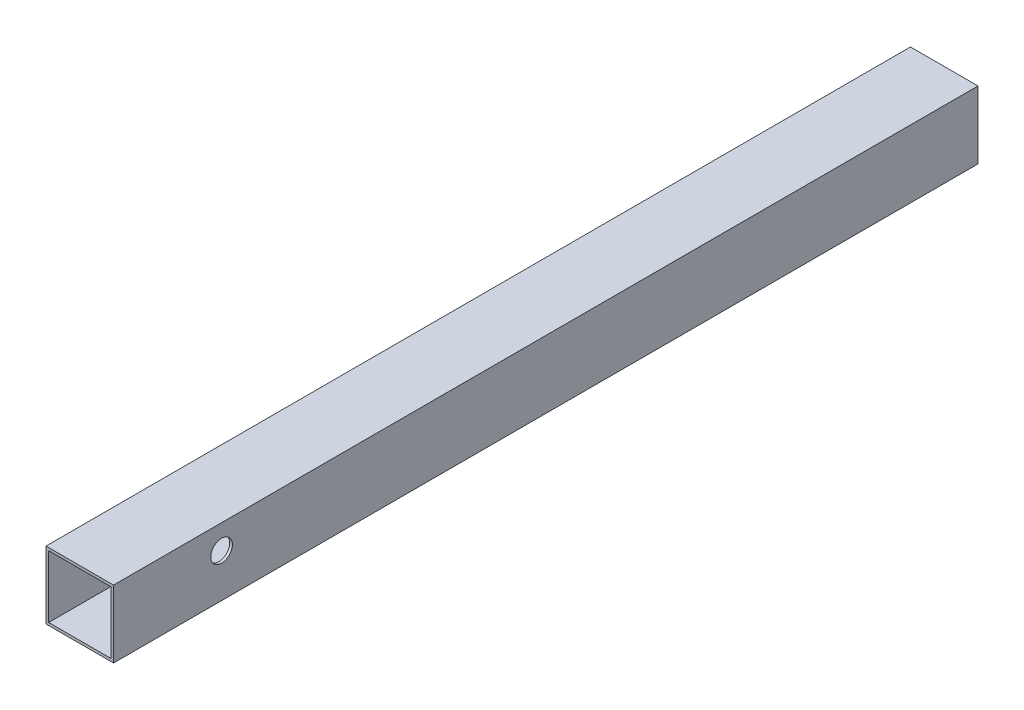
ISO-10303-21;
HEADER;
FILE_DESCRIPTION(('STEP AP214'),'2;1');
FILE_NAME('part.step','',(''),(''),'','','');
FILE_SCHEMA(('AUTOMOTIVE_DESIGN { 1 0 10303 214 1 1 1 1 }'));
ENDSEC;
DATA;
#1=APPLICATION_CONTEXT('core data for automotive mechanical design processes');
#2=APPLICATION_PROTOCOL_DEFINITION('international standard','automotive_design',2000,#1);
#3=PRODUCT_CONTEXT('',#1,'mechanical');
#4=PRODUCT('Part','Part','',(#3));
#5=PRODUCT_RELATED_PRODUCT_CATEGORY('part','',(#4));
#6=PRODUCT_DEFINITION_FORMATION('','',#4);
#7=PRODUCT_DEFINITION_CONTEXT('part definition',#1,'design');
#8=PRODUCT_DEFINITION('design','',#6,#7);
#9=PRODUCT_DEFINITION_SHAPE('','',#8);
#10=(LENGTH_UNIT() NAMED_UNIT(*) SI_UNIT(.MILLI.,.METRE.));
#11=(NAMED_UNIT(*) PLANE_ANGLE_UNIT() SI_UNIT($,.RADIAN.));
#12=(NAMED_UNIT(*) SI_UNIT($,.STERADIAN.) SOLID_ANGLE_UNIT());
#13=UNCERTAINTY_MEASURE_WITH_UNIT(LENGTH_MEASURE(1.E-05),#10,'distance_accuracy_value','');
#14=(GEOMETRIC_REPRESENTATION_CONTEXT(3) GLOBAL_UNCERTAINTY_ASSIGNED_CONTEXT((#13)) GLOBAL_UNIT_ASSIGNED_CONTEXT((#10,
#11,#12)) REPRESENTATION_CONTEXT('',''));
#15=CARTESIAN_POINT('',(0.,0.,0.));
#16=DIRECTION('',(0.,0.,1.));
#17=DIRECTION('',(1.,0.,0.));
#18=AXIS2_PLACEMENT_3D('',#15,#16,#17);
#19=CARTESIAN_POINT('',(0.,0.,320.));
#20=DIRECTION('',(0.,0.,-1.));
#21=DIRECTION('',(-1.,0.,0.));
#22=AXIS2_PLACEMENT_3D('',#19,#20,#21);
#23=PLANE('',#22);
#24=DIRECTION('',(0.,1.,0.));
#25=VECTOR('',#24,1.);
#26=CARTESIAN_POINT('',(12.5,-12.5,320.));
#27=LINE('',#26,#25);
#28=CARTESIAN_POINT('',(12.5,-12.5,320.));
#29=VERTEX_POINT('',#28);
#30=CARTESIAN_POINT('',(12.5,12.5,320.));
#31=VERTEX_POINT('',#30);
#32=EDGE_CURVE('E141',#29,#31,#27,.T.);
#33=ORIENTED_EDGE('',*,*,#32,.T.);
#34=DIRECTION('',(-1.,0.,0.));
#35=VECTOR('',#34,1.);
#36=CARTESIAN_POINT('',(-12.5,12.5,320.));
#37=LINE('',#36,#35);
#38=CARTESIAN_POINT('',(-12.5,12.5,320.));
#39=VERTEX_POINT('',#38);
#40=EDGE_CURVE('E144',#31,#39,#37,.T.);
#41=ORIENTED_EDGE('',*,*,#40,.T.);
#42=DIRECTION('',(0.,-1.,0.));
#43=VECTOR('',#42,1.);
#44=CARTESIAN_POINT('',(-12.5,-12.5,320.));
#45=LINE('',#44,#43);
#46=CARTESIAN_POINT('',(-12.5,-12.5,320.));
#47=VERTEX_POINT('',#46);
#48=EDGE_CURVE('E147',#39,#47,#45,.T.);
#49=ORIENTED_EDGE('',*,*,#48,.T.);
#50=DIRECTION('',(1.,0.,0.));
#51=VECTOR('',#50,1.);
#52=CARTESIAN_POINT('',(-12.5,-12.5,320.));
#53=LINE('',#52,#51);
#54=EDGE_CURVE('E149',#47,#29,#53,.T.);
#55=ORIENTED_EDGE('',*,*,#54,.T.);
#56=EDGE_LOOP('',(#33,#41,#49,#55));
#57=FACE_BOUND('',#56,.T.);
#58=DIRECTION('',(0.,-1.,0.));
#59=VECTOR('',#58,1.);
#60=CARTESIAN_POINT('',(-11.5,-11.5,320.));
#61=LINE('',#60,#59);
#62=CARTESIAN_POINT('',(-11.5,11.5,320.));
#63=VERTEX_POINT('',#62);
#64=CARTESIAN_POINT('',(-11.5,-11.5,320.));
#65=VERTEX_POINT('',#64);
#66=EDGE_CURVE('E103',#63,#65,#61,.T.);
#67=ORIENTED_EDGE('',*,*,#66,.F.);
#68=DIRECTION('',(-1.,0.,0.));
#69=VECTOR('',#68,1.);
#70=CARTESIAN_POINT('',(-11.5,11.5,320.));
#71=LINE('',#70,#69);
#72=CARTESIAN_POINT('',(11.5,11.5,320.));
#73=VERTEX_POINT('',#72);
#74=EDGE_CURVE('E125',#73,#63,#71,.T.);
#75=ORIENTED_EDGE('',*,*,#74,.F.);
#76=DIRECTION('',(0.,1.,0.));
#77=VECTOR('',#76,1.);
#78=CARTESIAN_POINT('',(11.5,-11.5,320.));
#79=LINE('',#78,#77);
#80=CARTESIAN_POINT('',(11.5,-11.5,320.));
#81=VERTEX_POINT('',#80);
#82=EDGE_CURVE('E123',#81,#73,#79,.T.);
#83=ORIENTED_EDGE('',*,*,#82,.F.);
#84=DIRECTION('',(1.,0.,0.));
#85=VECTOR('',#84,1.);
#86=CARTESIAN_POINT('',(-11.5,-11.5,320.));
#87=LINE('',#86,#85);
#88=EDGE_CURVE('E111',#65,#81,#87,.T.);
#89=ORIENTED_EDGE('',*,*,#88,.F.);
#90=EDGE_LOOP('',(#67,#75,#83,#89));
#91=FACE_BOUND('',#90,.T.);
#92=ADVANCED_FACE('F37',(#57,#91),#23,.F.);
#93=CARTESIAN_POINT('',(0.,0.,0.));
#94=DIRECTION('',(0.,0.,-1.));
#95=DIRECTION('',(-1.,0.,0.));
#96=AXIS2_PLACEMENT_3D('',#93,#94,#95);
#97=PLANE('',#96);
#98=DIRECTION('',(0.,1.,0.));
#99=VECTOR('',#98,1.);
#100=CARTESIAN_POINT('',(12.5,-12.5,0.));
#101=LINE('',#100,#99);
#102=CARTESIAN_POINT('',(12.5,-12.5,0.));
#103=VERTEX_POINT('',#102);
#104=CARTESIAN_POINT('',(12.5,12.5,0.));
#105=VERTEX_POINT('',#104);
#106=EDGE_CURVE('E119',#103,#105,#101,.T.);
#107=ORIENTED_EDGE('',*,*,#106,.F.);
#108=DIRECTION('',(1.,0.,0.));
#109=VECTOR('',#108,1.);
#110=CARTESIAN_POINT('',(-12.5,-12.5,0.));
#111=LINE('',#110,#109);
#112=CARTESIAN_POINT('',(-12.5,-12.5,0.));
#113=VERTEX_POINT('',#112);
#114=EDGE_CURVE('E145',#113,#103,#111,.T.);
#115=ORIENTED_EDGE('',*,*,#114,.F.);
#116=DIRECTION('',(0.,-1.,0.));
#117=VECTOR('',#116,1.);
#118=CARTESIAN_POINT('',(-12.5,-12.5,0.));
#119=LINE('',#118,#117);
#120=CARTESIAN_POINT('',(-12.5,12.5,0.));
#121=VERTEX_POINT('',#120);
#122=EDGE_CURVE('E156',#121,#113,#119,.T.);
#123=ORIENTED_EDGE('',*,*,#122,.F.);
#124=DIRECTION('',(-1.,0.,0.));
#125=VECTOR('',#124,1.);
#126=CARTESIAN_POINT('',(-12.5,12.5,0.));
#127=LINE('',#126,#125);
#128=EDGE_CURVE('E154',#105,#121,#127,.T.);
#129=ORIENTED_EDGE('',*,*,#128,.F.);
#130=EDGE_LOOP('',(#107,#115,#123,#129));
#131=FACE_BOUND('',#130,.T.);
#132=DIRECTION('',(-1.,0.,0.));
#133=VECTOR('',#132,1.);
#134=CARTESIAN_POINT('',(-11.5,11.5,0.));
#135=LINE('',#134,#133);
#136=CARTESIAN_POINT('',(11.5,11.5,0.));
#137=VERTEX_POINT('',#136);
#138=CARTESIAN_POINT('',(-11.5,11.5,0.));
#139=VERTEX_POINT('',#138);
#140=EDGE_CURVE('E112',#137,#139,#135,.T.);
#141=ORIENTED_EDGE('',*,*,#140,.T.);
#142=DIRECTION('',(0.,-1.,0.));
#143=VECTOR('',#142,1.);
#144=CARTESIAN_POINT('',(-11.5,-11.5,0.));
#145=LINE('',#144,#143);
#146=CARTESIAN_POINT('',(-11.5,-11.5,0.));
#147=VERTEX_POINT('',#146);
#148=EDGE_CURVE('E61',#139,#147,#145,.T.);
#149=ORIENTED_EDGE('',*,*,#148,.T.);
#150=DIRECTION('',(1.,0.,0.));
#151=VECTOR('',#150,1.);
#152=CARTESIAN_POINT('',(-11.5,-11.5,0.));
#153=LINE('',#152,#151);
#154=CARTESIAN_POINT('',(11.5,-11.5,0.));
#155=VERTEX_POINT('',#154);
#156=EDGE_CURVE('E118',#147,#155,#153,.T.);
#157=ORIENTED_EDGE('',*,*,#156,.T.);
#158=DIRECTION('',(0.,1.,0.));
#159=VECTOR('',#158,1.);
#160=CARTESIAN_POINT('',(11.5,-11.5,0.));
#161=LINE('',#160,#159);
#162=EDGE_CURVE('E133',#155,#137,#161,.T.);
#163=ORIENTED_EDGE('',*,*,#162,.T.);
#164=EDGE_LOOP('',(#141,#149,#157,#163));
#165=FACE_BOUND('',#164,.T.);
#166=ADVANCED_FACE('F175',(#131,#165),#97,.T.);
#167=CARTESIAN_POINT('',(12.5,-12.5,320.));
#168=DIRECTION('',(-1.,0.,0.));
#169=DIRECTION('',(0.,0.,1.));
#170=AXIS2_PLACEMENT_3D('',#167,#168,#169);
#171=PLANE('',#170);
#172=CARTESIAN_POINT('',(12.5,3.5,280.));
#173=DIRECTION('',(1.,0.,0.));
#174=DIRECTION('',(0.,0.,-1.));
#175=AXIS2_PLACEMENT_3D('',#172,#173,#174);
#176=CIRCLE('',#175,3.99999999999999);
#177=CARTESIAN_POINT('',(12.5,3.5,276.));
#178=VERTEX_POINT('',#177);
#179=EDGE_CURVE('E218',#178,#178,#176,.T.);
#180=ORIENTED_EDGE('',*,*,#179,.F.);
#181=EDGE_LOOP('',(#180));
#182=FACE_BOUND('',#181,.T.);
#183=ORIENTED_EDGE('',*,*,#106,.T.);
#184=DIRECTION('',(0.,0.,-1.));
#185=VECTOR('',#184,1.);
#186=CARTESIAN_POINT('',(12.5,12.5,320.));
#187=LINE('',#186,#185);
#188=EDGE_CURVE('E11',#31,#105,#187,.T.);
#189=ORIENTED_EDGE('',*,*,#188,.F.);
#190=ORIENTED_EDGE('',*,*,#32,.F.);
#191=DIRECTION('',(0.,0.,-1.));
#192=VECTOR('',#191,1.);
#193=CARTESIAN_POINT('',(12.5,-12.5,320.));
#194=LINE('',#193,#192);
#195=EDGE_CURVE('E151',#29,#103,#194,.T.);
#196=ORIENTED_EDGE('',*,*,#195,.T.);
#197=EDGE_LOOP('',(#183,#189,#190,#196));
#198=FACE_BOUND('',#197,.T.);
#199=ADVANCED_FACE('F39',(#182,#198),#171,.F.);
#200=CARTESIAN_POINT('',(-12.5,12.5,320.));
#201=DIRECTION('',(0.,-1.,0.));
#202=DIRECTION('',(0.,0.,-1.));
#203=AXIS2_PLACEMENT_3D('',#200,#201,#202);
#204=PLANE('',#203);
#205=ORIENTED_EDGE('',*,*,#128,.T.);
#206=DIRECTION('',(0.,0.,-1.));
#207=VECTOR('',#206,1.);
#208=CARTESIAN_POINT('',(-12.5,12.5,320.));
#209=LINE('',#208,#207);
#210=EDGE_CURVE('E46',#39,#121,#209,.T.);
#211=ORIENTED_EDGE('',*,*,#210,.F.);
#212=ORIENTED_EDGE('',*,*,#40,.F.);
#213=ORIENTED_EDGE('',*,*,#188,.T.);
#214=EDGE_LOOP('',(#205,#211,#212,#213));
#215=FACE_BOUND('',#214,.T.);
#216=ADVANCED_FACE('F185',(#215),#204,.F.);
#217=CARTESIAN_POINT('',(-12.5,-12.5,320.));
#218=DIRECTION('',(1.,0.,0.));
#219=DIRECTION('',(0.,0.,-1.));
#220=AXIS2_PLACEMENT_3D('',#217,#218,#219);
#221=PLANE('',#220);
#222=CARTESIAN_POINT('',(-12.5,3.5,280.));
#223=DIRECTION('',(1.,0.,0.));
#224=DIRECTION('',(0.,0.,-1.));
#225=AXIS2_PLACEMENT_3D('',#222,#223,#224);
#226=CIRCLE('',#225,3.99999999999999);
#227=CARTESIAN_POINT('',(-12.5,3.5,276.));
#228=VERTEX_POINT('',#227);
#229=EDGE_CURVE('E216',#228,#228,#226,.T.);
#230=ORIENTED_EDGE('',*,*,#229,.T.);
#231=EDGE_LOOP('',(#230));
#232=FACE_BOUND('',#231,.T.);
#233=ORIENTED_EDGE('',*,*,#122,.T.);
#234=DIRECTION('',(0.,0.,-1.));
#235=VECTOR('',#234,1.);
#236=CARTESIAN_POINT('',(-12.5,-12.5,320.));
#237=LINE('',#236,#235);
#238=EDGE_CURVE('E161',#47,#113,#237,.T.);
#239=ORIENTED_EDGE('',*,*,#238,.F.);
#240=ORIENTED_EDGE('',*,*,#48,.F.);
#241=ORIENTED_EDGE('',*,*,#210,.T.);
#242=EDGE_LOOP('',(#233,#239,#240,#241));
#243=FACE_BOUND('',#242,.T.);
#244=ADVANCED_FACE('F169',(#232,#243),#221,.F.);
#245=CARTESIAN_POINT('',(-12.5,-12.5,320.));
#246=DIRECTION('',(0.,1.,0.));
#247=DIRECTION('',(0.,0.,1.));
#248=AXIS2_PLACEMENT_3D('',#245,#246,#247);
#249=PLANE('',#248);
#250=ORIENTED_EDGE('',*,*,#114,.T.);
#251=ORIENTED_EDGE('',*,*,#195,.F.);
#252=ORIENTED_EDGE('',*,*,#54,.F.);
#253=ORIENTED_EDGE('',*,*,#238,.T.);
#254=EDGE_LOOP('',(#250,#251,#252,#253));
#255=FACE_BOUND('',#254,.T.);
#256=ADVANCED_FACE('F179',(#255),#249,.F.);
#257=CARTESIAN_POINT('',(-11.5,-11.5,320.));
#258=DIRECTION('',(1.,0.,0.));
#259=DIRECTION('',(0.,0.,-1.));
#260=AXIS2_PLACEMENT_3D('',#257,#258,#259);
#261=PLANE('',#260);
#262=CARTESIAN_POINT('',(-11.5,3.5,280.));
#263=DIRECTION('',(1.,0.,0.));
#264=DIRECTION('',(0.,0.,-1.));
#265=AXIS2_PLACEMENT_3D('',#262,#263,#264);
#266=CIRCLE('',#265,3.99999999999999);
#267=CARTESIAN_POINT('',(-11.5,3.5,276.));
#268=VERTEX_POINT('',#267);
#269=EDGE_CURVE('E131',#268,#268,#266,.T.);
#270=ORIENTED_EDGE('',*,*,#269,.F.);
#271=EDGE_LOOP('',(#270));
#272=FACE_BOUND('',#271,.T.);
#273=ORIENTED_EDGE('',*,*,#148,.F.);
#274=DIRECTION('',(0.,0.,-1.));
#275=VECTOR('',#274,1.);
#276=CARTESIAN_POINT('',(-11.5,11.5,320.));
#277=LINE('',#276,#275);
#278=EDGE_CURVE('E107',#63,#139,#277,.T.);
#279=ORIENTED_EDGE('',*,*,#278,.F.);
#280=ORIENTED_EDGE('',*,*,#66,.T.);
#281=DIRECTION('',(0.,0.,-1.));
#282=VECTOR('',#281,1.);
#283=CARTESIAN_POINT('',(-11.5,-11.5,320.));
#284=LINE('',#283,#282);
#285=EDGE_CURVE('E106',#65,#147,#284,.T.);
#286=ORIENTED_EDGE('',*,*,#285,.T.);
#287=EDGE_LOOP('',(#273,#279,#280,#286));
#288=FACE_BOUND('',#287,.T.);
#289=ADVANCED_FACE('F105',(#272,#288),#261,.T.);
#290=CARTESIAN_POINT('',(-11.5,-11.5,320.));
#291=DIRECTION('',(0.,1.,0.));
#292=DIRECTION('',(0.,0.,1.));
#293=AXIS2_PLACEMENT_3D('',#290,#291,#292);
#294=PLANE('',#293);
#295=ORIENTED_EDGE('',*,*,#156,.F.);
#296=ORIENTED_EDGE('',*,*,#285,.F.);
#297=ORIENTED_EDGE('',*,*,#88,.T.);
#298=DIRECTION('',(0.,0.,-1.));
#299=VECTOR('',#298,1.);
#300=CARTESIAN_POINT('',(11.5,-11.5,320.));
#301=LINE('',#300,#299);
#302=EDGE_CURVE('E120',#81,#155,#301,.T.);
#303=ORIENTED_EDGE('',*,*,#302,.T.);
#304=EDGE_LOOP('',(#295,#296,#297,#303));
#305=FACE_BOUND('',#304,.T.);
#306=ADVANCED_FACE('F115',(#305),#294,.T.);
#307=CARTESIAN_POINT('',(11.5,-11.5,320.));
#308=DIRECTION('',(-1.,0.,0.));
#309=DIRECTION('',(0.,0.,1.));
#310=AXIS2_PLACEMENT_3D('',#307,#308,#309);
#311=PLANE('',#310);
#312=CARTESIAN_POINT('',(11.5,3.5,280.));
#313=DIRECTION('',(-1.,0.,0.));
#314=DIRECTION('',(0.,0.,1.));
#315=AXIS2_PLACEMENT_3D('',#312,#313,#314);
#316=CIRCLE('',#315,3.99999999999999);
#317=CARTESIAN_POINT('',(11.5,3.5,284.));
#318=VERTEX_POINT('',#317);
#319=EDGE_CURVE('E41',#318,#318,#316,.T.);
#320=ORIENTED_EDGE('',*,*,#319,.F.);
#321=EDGE_LOOP('',(#320));
#322=FACE_BOUND('',#321,.T.);
#323=ORIENTED_EDGE('',*,*,#162,.F.);
#324=ORIENTED_EDGE('',*,*,#302,.F.);
#325=ORIENTED_EDGE('',*,*,#82,.T.);
#326=DIRECTION('',(0.,0.,-1.));
#327=VECTOR('',#326,1.);
#328=CARTESIAN_POINT('',(11.5,11.5,320.));
#329=LINE('',#328,#327);
#330=EDGE_CURVE('E53',#73,#137,#329,.T.);
#331=ORIENTED_EDGE('',*,*,#330,.T.);
#332=EDGE_LOOP('',(#323,#324,#325,#331));
#333=FACE_BOUND('',#332,.T.);
#334=ADVANCED_FACE('F211',(#322,#333),#311,.T.);
#335=CARTESIAN_POINT('',(-11.5,11.5,320.));
#336=DIRECTION('',(0.,-1.,0.));
#337=DIRECTION('',(0.,0.,-1.));
#338=AXIS2_PLACEMENT_3D('',#335,#336,#337);
#339=PLANE('',#338);
#340=ORIENTED_EDGE('',*,*,#140,.F.);
#341=ORIENTED_EDGE('',*,*,#330,.F.);
#342=ORIENTED_EDGE('',*,*,#74,.T.);
#343=ORIENTED_EDGE('',*,*,#278,.T.);
#344=EDGE_LOOP('',(#340,#341,#342,#343));
#345=FACE_BOUND('',#344,.T.);
#346=ADVANCED_FACE('F231',(#345),#339,.T.);
#347=CARTESIAN_POINT('',(-12.5,3.5,280.));
#348=DIRECTION('',(1.,0.,0.));
#349=DIRECTION('',(0.,0.,-1.));
#350=AXIS2_PLACEMENT_3D('',#347,#348,#349);
#351=CYLINDRICAL_SURFACE('',#350,3.99999999999999);
#352=ORIENTED_EDGE('',*,*,#319,.T.);
#353=EDGE_LOOP('',(#352));
#354=FACE_BOUND('',#353,.T.);
#355=ORIENTED_EDGE('',*,*,#179,.T.);
#356=EDGE_LOOP('',(#355));
#357=FACE_BOUND('',#356,.T.);
#358=ADVANCED_FACE('F226',(#354,#357),#351,.F.);
#359=ORIENTED_EDGE('',*,*,#269,.T.);
#360=EDGE_LOOP('',(#359));
#361=FACE_BOUND('',#360,.T.);
#362=ORIENTED_EDGE('',*,*,#229,.F.);
#363=EDGE_LOOP('',(#362));
#364=FACE_BOUND('',#363,.T.);
#365=ADVANCED_FACE('F224',(#361,#364),#351,.F.);
#366=CLOSED_SHELL('',(#92,#166,#199,#216,#244,#256,#289,#306,#334,#346,#358,#365));
#367=MANIFOLD_SOLID_BREP('B2',#366);
#368=ADVANCED_BREP_SHAPE_REPRESENTATION('',(#18,#367),#14);
#369=SHAPE_DEFINITION_REPRESENTATION(#9,#368);
ENDSEC;
END-ISO-10303-21;
